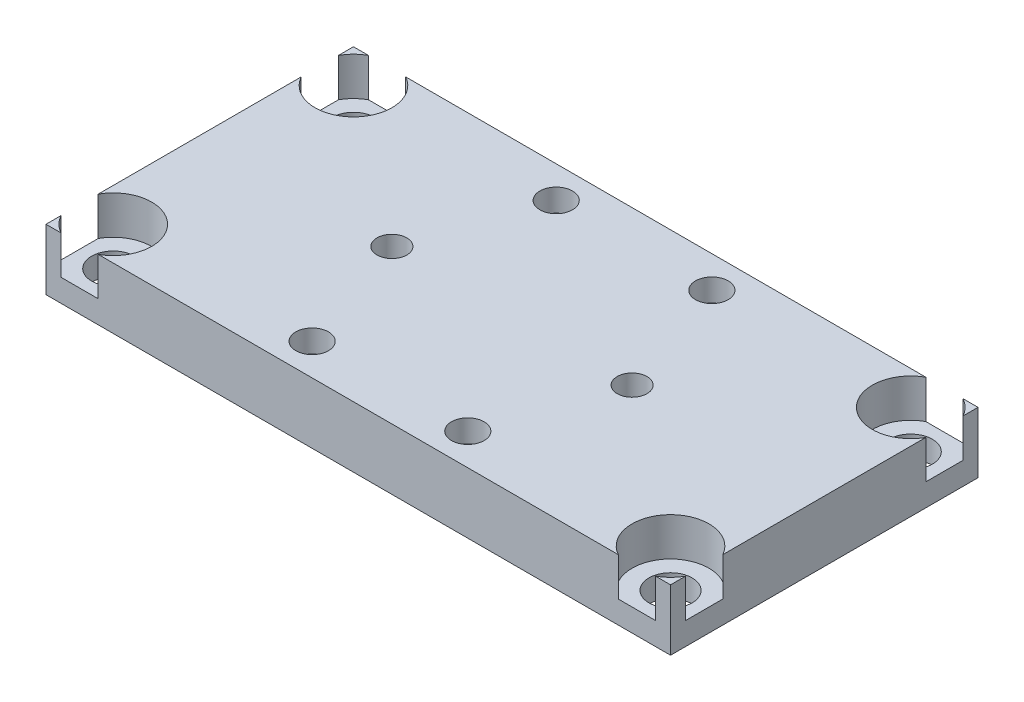
ISO-10303-21;
HEADER;
FILE_DESCRIPTION(('STEP AP214'),'2;1');
FILE_NAME('part.step','',(''),(''),'','','');
FILE_SCHEMA(('AUTOMOTIVE_DESIGN { 1 0 10303 214 1 1 1 1 }'));
ENDSEC;
DATA;
#1=APPLICATION_CONTEXT('core data for automotive mechanical design processes');
#2=APPLICATION_PROTOCOL_DEFINITION('international standard','automotive_design',2000,#1);
#3=PRODUCT_CONTEXT('',#1,'mechanical');
#4=PRODUCT('Part','Part','',(#3));
#5=PRODUCT_RELATED_PRODUCT_CATEGORY('part','',(#4));
#6=PRODUCT_DEFINITION_FORMATION('','',#4);
#7=PRODUCT_DEFINITION_CONTEXT('part definition',#1,'design');
#8=PRODUCT_DEFINITION('design','',#6,#7);
#9=PRODUCT_DEFINITION_SHAPE('','',#8);
#10=(LENGTH_UNIT() NAMED_UNIT(*) SI_UNIT(.MILLI.,.METRE.));
#11=(NAMED_UNIT(*) PLANE_ANGLE_UNIT() SI_UNIT($,.RADIAN.));
#12=(NAMED_UNIT(*) SI_UNIT($,.STERADIAN.) SOLID_ANGLE_UNIT());
#13=UNCERTAINTY_MEASURE_WITH_UNIT(LENGTH_MEASURE(1.E-05),#10,'distance_accuracy_value','');
#14=(GEOMETRIC_REPRESENTATION_CONTEXT(3) GLOBAL_UNCERTAINTY_ASSIGNED_CONTEXT((#13)) GLOBAL_UNIT_ASSIGNED_CONTEXT((#10,
#11,#12)) REPRESENTATION_CONTEXT('',''));
#15=CARTESIAN_POINT('',(0.,0.,0.));
#16=DIRECTION('',(0.,0.,1.));
#17=DIRECTION('',(1.,0.,0.));
#18=AXIS2_PLACEMENT_3D('',#15,#16,#17);
#19=CARTESIAN_POINT('',(32.5,6.35,-16.));
#20=DIRECTION('',(0.,-1.,0.));
#21=DIRECTION('',(0.,0.,-1.));
#22=AXIS2_PLACEMENT_3D('',#19,#20,#21);
#23=PLANE('',#22);
#24=DIRECTION('',(0.,0.,-1.));
#25=VECTOR('',#24,1.);
#26=CARTESIAN_POINT('',(32.5,6.35,16.));
#27=LINE('',#26,#25);
#28=CARTESIAN_POINT('',(32.5,6.35,16.));
#29=VERTEX_POINT('',#28);
#30=CARTESIAN_POINT('',(32.5,6.35,14.4364916731037));
#31=VERTEX_POINT('',#30);
#32=EDGE_CURVE('E330',#29,#31,#27,.T.);
#33=ORIENTED_EDGE('',*,*,#32,.T.);
#34=CARTESIAN_POINT('',(29.,6.35,12.5));
#35=DIRECTION('',(0.,1.,0.));
#36=DIRECTION('',(0.,0.,1.));
#37=AXIS2_PLACEMENT_3D('',#34,#35,#36);
#38=CIRCLE('',#37,4.);
#39=CARTESIAN_POINT('',(30.9364916731037,6.35,16.));
#40=VERTEX_POINT('',#39);
#41=EDGE_CURVE('E242',#40,#31,#38,.T.);
#42=ORIENTED_EDGE('',*,*,#41,.F.);
#43=DIRECTION('',(1.,0.,0.));
#44=VECTOR('',#43,1.);
#45=CARTESIAN_POINT('',(-32.5,6.35,16.));
#46=LINE('',#45,#44);
#47=EDGE_CURVE('E344',#40,#29,#46,.T.);
#48=ORIENTED_EDGE('',*,*,#47,.T.);
#49=EDGE_LOOP('',(#33,#42,#48));
#50=FACE_BOUND('',#49,.T.);
#51=ADVANCED_FACE('F31',(#50),#23,.F.);
#52=DIRECTION('',(-1.,0.,0.));
#53=VECTOR('',#52,1.);
#54=CARTESIAN_POINT('',(-32.5,6.35,-16.));
#55=LINE('',#54,#53);
#56=CARTESIAN_POINT('',(32.5,6.35,-16.));
#57=VERTEX_POINT('',#56);
#58=CARTESIAN_POINT('',(30.9364916731037,6.35,-16.));
#59=VERTEX_POINT('',#58);
#60=EDGE_CURVE('E336',#57,#59,#55,.T.);
#61=ORIENTED_EDGE('',*,*,#60,.T.);
#62=CARTESIAN_POINT('',(29.,6.35,-12.5));
#63=DIRECTION('',(0.,1.,0.));
#64=DIRECTION('',(0.,0.,1.));
#65=AXIS2_PLACEMENT_3D('',#62,#63,#64);
#66=CIRCLE('',#65,4.);
#67=CARTESIAN_POINT('',(32.5,6.35,-14.4364916731037));
#68=VERTEX_POINT('',#67);
#69=EDGE_CURVE('E264',#68,#59,#66,.T.);
#70=ORIENTED_EDGE('',*,*,#69,.F.);
#71=EDGE_CURVE('E335',#68,#57,#27,.T.);
#72=ORIENTED_EDGE('',*,*,#71,.T.);
#73=EDGE_LOOP('',(#61,#70,#72));
#74=FACE_BOUND('',#73,.T.);
#75=ADVANCED_FACE('F418',(#74),#23,.F.);
#76=CARTESIAN_POINT('',(-32.5,6.35,16.));
#77=VERTEX_POINT('',#76);
#78=CARTESIAN_POINT('',(-30.9364916731037,6.35,16.));
#79=VERTEX_POINT('',#78);
#80=EDGE_CURVE('E346',#77,#79,#46,.T.);
#81=ORIENTED_EDGE('',*,*,#80,.T.);
#82=CARTESIAN_POINT('',(-29.,6.35,12.5));
#83=DIRECTION('',(0.,1.,0.));
#84=DIRECTION('',(0.,0.,1.));
#85=AXIS2_PLACEMENT_3D('',#82,#83,#84);
#86=CIRCLE('',#85,4.);
#87=CARTESIAN_POINT('',(-32.5,6.35,14.4364916731037));
#88=VERTEX_POINT('',#87);
#89=EDGE_CURVE('E282',#88,#79,#86,.T.);
#90=ORIENTED_EDGE('',*,*,#89,.F.);
#91=DIRECTION('',(0.,0.,1.));
#92=VECTOR('',#91,1.);
#93=CARTESIAN_POINT('',(-32.5,6.35,16.));
#94=LINE('',#93,#92);
#95=EDGE_CURVE('E339',#88,#77,#94,.T.);
#96=ORIENTED_EDGE('',*,*,#95,.T.);
#97=EDGE_LOOP('',(#81,#90,#96));
#98=FACE_BOUND('',#97,.T.);
#99=ADVANCED_FACE('F470',(#98),#23,.F.);
#100=CARTESIAN_POINT('',(12.5,6.35,0.));
#101=DIRECTION('',(0.,1.,0.));
#102=DIRECTION('',(0.,0.,1.));
#103=AXIS2_PLACEMENT_3D('',#100,#101,#102);
#104=CIRCLE('',#103,1.55);
#105=CARTESIAN_POINT('',(12.5,6.35,1.55));
#106=VERTEX_POINT('',#105);
#107=EDGE_CURVE('E183',#106,#106,#104,.T.);
#108=ORIENTED_EDGE('',*,*,#107,.F.);
#109=EDGE_LOOP('',(#108));
#110=FACE_BOUND('',#109,.T.);
#111=CARTESIAN_POINT('',(-12.5,6.35,0.));
#112=DIRECTION('',(0.,1.,0.));
#113=DIRECTION('',(0.,0.,1.));
#114=AXIS2_PLACEMENT_3D('',#111,#112,#113);
#115=CIRCLE('',#114,1.55);
#116=CARTESIAN_POINT('',(-12.5,6.35,1.55));
#117=VERTEX_POINT('',#116);
#118=EDGE_CURVE('E182',#117,#117,#115,.T.);
#119=ORIENTED_EDGE('',*,*,#118,.F.);
#120=EDGE_LOOP('',(#119));
#121=FACE_BOUND('',#120,.T.);
#122=CARTESIAN_POINT('',(8.1,6.35,-12.7));
#123=DIRECTION('',(0.,-1.,0.));
#124=DIRECTION('',(0.,0.,-1.));
#125=AXIS2_PLACEMENT_3D('',#122,#123,#124);
#126=CIRCLE('',#125,1.7);
#127=CARTESIAN_POINT('',(8.1,6.35,-14.4));
#128=VERTEX_POINT('',#127);
#129=EDGE_CURVE('E202',#128,#128,#126,.T.);
#130=ORIENTED_EDGE('',*,*,#129,.T.);
#131=EDGE_LOOP('',(#130));
#132=FACE_BOUND('',#131,.T.);
#133=CARTESIAN_POINT('',(8.1,6.35,12.7));
#134=DIRECTION('',(0.,-1.,0.));
#135=DIRECTION('',(0.,0.,-1.));
#136=AXIS2_PLACEMENT_3D('',#133,#134,#135);
#137=CIRCLE('',#136,1.7);
#138=CARTESIAN_POINT('',(8.1,6.35,11.));
#139=VERTEX_POINT('',#138);
#140=EDGE_CURVE('E214',#139,#139,#137,.T.);
#141=ORIENTED_EDGE('',*,*,#140,.T.);
#142=EDGE_LOOP('',(#141));
#143=FACE_BOUND('',#142,.T.);
#144=CARTESIAN_POINT('',(-8.1,6.35,-12.7));
#145=DIRECTION('',(0.,-1.,0.));
#146=DIRECTION('',(0.,0.,-1.));
#147=AXIS2_PLACEMENT_3D('',#144,#145,#146);
#148=CIRCLE('',#147,1.7);
#149=CARTESIAN_POINT('',(-8.1,6.35,-14.4));
#150=VERTEX_POINT('',#149);
#151=EDGE_CURVE('E226',#150,#150,#148,.T.);
#152=ORIENTED_EDGE('',*,*,#151,.T.);
#153=EDGE_LOOP('',(#152));
#154=FACE_BOUND('',#153,.T.);
#155=CARTESIAN_POINT('',(-8.1,6.35,12.7));
#156=DIRECTION('',(0.,-1.,0.));
#157=DIRECTION('',(0.,0.,-1.));
#158=AXIS2_PLACEMENT_3D('',#155,#156,#157);
#159=CIRCLE('',#158,1.7);
#160=CARTESIAN_POINT('',(-8.1,6.35,11.));
#161=VERTEX_POINT('',#160);
#162=EDGE_CURVE('E238',#161,#161,#159,.T.);
#163=ORIENTED_EDGE('',*,*,#162,.T.);
#164=EDGE_LOOP('',(#163));
#165=FACE_BOUND('',#164,.T.);
#166=CARTESIAN_POINT('',(-27.0635083268963,6.35,16.));
#167=VERTEX_POINT('',#166);
#168=CARTESIAN_POINT('',(27.0635083268963,6.35,16.));
#169=VERTEX_POINT('',#168);
#170=EDGE_CURVE('E350',#167,#169,#46,.T.);
#171=ORIENTED_EDGE('',*,*,#170,.T.);
#172=CARTESIAN_POINT('',(32.5,6.35,10.5635083268963));
#173=VERTEX_POINT('',#172);
#174=EDGE_CURVE('E241',#173,#169,#38,.T.);
#175=ORIENTED_EDGE('',*,*,#174,.F.);
#176=CARTESIAN_POINT('',(32.5,6.35,-10.5635083268963));
#177=VERTEX_POINT('',#176);
#178=EDGE_CURVE('E334',#173,#177,#27,.T.);
#179=ORIENTED_EDGE('',*,*,#178,.T.);
#180=CARTESIAN_POINT('',(27.0635083268963,6.35,-16.));
#181=VERTEX_POINT('',#180);
#182=EDGE_CURVE('E261',#181,#177,#66,.T.);
#183=ORIENTED_EDGE('',*,*,#182,.F.);
#184=CARTESIAN_POINT('',(-27.0635083268963,6.35,-16.));
#185=VERTEX_POINT('',#184);
#186=EDGE_CURVE('E340',#181,#185,#55,.T.);
#187=ORIENTED_EDGE('',*,*,#186,.T.);
#188=CARTESIAN_POINT('',(-29.,6.35,-12.5));
#189=DIRECTION('',(0.,-1.,0.));
#190=DIRECTION('',(0.,0.,-1.));
#191=AXIS2_PLACEMENT_3D('',#188,#189,#190);
#192=CIRCLE('',#191,4.);
#193=CARTESIAN_POINT('',(-32.5,6.35,-10.5635083268963));
#194=VERTEX_POINT('',#193);
#195=EDGE_CURVE('E373',#185,#194,#192,.T.);
#196=ORIENTED_EDGE('',*,*,#195,.T.);
#197=CARTESIAN_POINT('',(-32.5,6.35,10.5635083268963));
#198=VERTEX_POINT('',#197);
#199=EDGE_CURVE('E345',#194,#198,#94,.T.);
#200=ORIENTED_EDGE('',*,*,#199,.T.);
#201=EDGE_CURVE('E283',#167,#198,#86,.T.);
#202=ORIENTED_EDGE('',*,*,#201,.F.);
#203=EDGE_LOOP('',(#171,#175,#179,#183,#187,#196,#200,#202));
#204=FACE_BOUND('',#203,.T.);
#205=ADVANCED_FACE('F440',(#110,#121,#132,#143,#154,#165,#204),#23,.F.);
#206=CARTESIAN_POINT('',(32.5,6.35,16.));
#207=DIRECTION('',(-1.,0.,0.));
#208=DIRECTION('',(0.,0.,1.));
#209=AXIS2_PLACEMENT_3D('',#206,#207,#208);
#210=PLANE('',#209);
#211=DIRECTION('',(0.,0.,1.));
#212=VECTOR('',#211,1.);
#213=CARTESIAN_POINT('',(32.5,2.35,16.));
#214=LINE('',#213,#212);
#215=CARTESIAN_POINT('',(32.5,2.35,10.5635083268963));
#216=VERTEX_POINT('',#215);
#217=CARTESIAN_POINT('',(32.5,2.35,14.4364916731037));
#218=VERTEX_POINT('',#217);
#219=EDGE_CURVE('E258',#216,#218,#214,.T.);
#220=ORIENTED_EDGE('',*,*,#219,.T.);
#221=DIRECTION('',(0.,1.,0.));
#222=VECTOR('',#221,1.);
#223=CARTESIAN_POINT('',(32.5,6.35,14.4364916731037));
#224=LINE('',#223,#222);
#225=EDGE_CURVE('E255',#218,#31,#224,.T.);
#226=ORIENTED_EDGE('',*,*,#225,.T.);
#227=ORIENTED_EDGE('',*,*,#32,.F.);
#228=DIRECTION('',(0.,-1.,0.));
#229=VECTOR('',#228,1.);
#230=CARTESIAN_POINT('',(32.5,6.35,16.));
#231=LINE('',#230,#229);
#232=CARTESIAN_POINT('',(32.5,0.,16.));
#233=VERTEX_POINT('',#232);
#234=EDGE_CURVE('E349',#29,#233,#231,.T.);
#235=ORIENTED_EDGE('',*,*,#234,.T.);
#236=DIRECTION('',(0.,0.,-1.));
#237=VECTOR('',#236,1.);
#238=CARTESIAN_POINT('',(32.5,0.,16.));
#239=LINE('',#238,#237);
#240=CARTESIAN_POINT('',(32.5,0.,-16.));
#241=VERTEX_POINT('',#240);
#242=EDGE_CURVE('E329',#233,#241,#239,.T.);
#243=ORIENTED_EDGE('',*,*,#242,.T.);
#244=DIRECTION('',(0.,-1.,0.));
#245=VECTOR('',#244,1.);
#246=CARTESIAN_POINT('',(32.5,6.35,-16.));
#247=LINE('',#246,#245);
#248=EDGE_CURVE('E367',#57,#241,#247,.T.);
#249=ORIENTED_EDGE('',*,*,#248,.F.);
#250=ORIENTED_EDGE('',*,*,#71,.F.);
#251=DIRECTION('',(0.,1.,0.));
#252=VECTOR('',#251,1.);
#253=CARTESIAN_POINT('',(32.5,6.35,-14.4364916731037));
#254=LINE('',#253,#252);
#255=CARTESIAN_POINT('',(32.5,2.35,-14.4364916731037));
#256=VERTEX_POINT('',#255);
#257=EDGE_CURVE('E273',#68,#256,#254,.F.);
#258=ORIENTED_EDGE('',*,*,#257,.T.);
#259=DIRECTION('',(0.,0.,1.));
#260=VECTOR('',#259,1.);
#261=CARTESIAN_POINT('',(32.5,2.35,16.));
#262=LINE('',#261,#260);
#263=CARTESIAN_POINT('',(32.5,2.35,-10.5635083268963));
#264=VERTEX_POINT('',#263);
#265=EDGE_CURVE('E279',#256,#264,#262,.T.);
#266=ORIENTED_EDGE('',*,*,#265,.T.);
#267=DIRECTION('',(0.,1.,0.));
#268=VECTOR('',#267,1.);
#269=CARTESIAN_POINT('',(32.5,6.35,-10.5635083268963));
#270=LINE('',#269,#268);
#271=EDGE_CURVE('E276',#264,#177,#270,.T.);
#272=ORIENTED_EDGE('',*,*,#271,.T.);
#273=ORIENTED_EDGE('',*,*,#178,.F.);
#274=DIRECTION('',(0.,1.,0.));
#275=VECTOR('',#274,1.);
#276=CARTESIAN_POINT('',(32.5,6.35,10.5635083268963));
#277=LINE('',#276,#275);
#278=EDGE_CURVE('E252',#173,#216,#277,.F.);
#279=ORIENTED_EDGE('',*,*,#278,.T.);
#280=EDGE_LOOP('',(#220,#226,#227,#235,#243,#249,#250,#258,#266,#272,#273,#279));
#281=FACE_BOUND('',#280,.T.);
#282=ADVANCED_FACE('F33',(#281),#210,.F.);
#283=CARTESIAN_POINT('',(-32.5,6.35,-16.));
#284=DIRECTION('',(0.,0.,1.));
#285=DIRECTION('',(1.,0.,0.));
#286=AXIS2_PLACEMENT_3D('',#283,#284,#285);
#287=PLANE('',#286);
#288=DIRECTION('',(1.,0.,0.));
#289=VECTOR('',#288,1.);
#290=CARTESIAN_POINT('',(-32.5,2.35,-16.));
#291=LINE('',#290,#289);
#292=CARTESIAN_POINT('',(27.0635083268963,2.35,-16.));
#293=VERTEX_POINT('',#292);
#294=CARTESIAN_POINT('',(30.9364916731037,2.35,-16.));
#295=VERTEX_POINT('',#294);
#296=EDGE_CURVE('E389',#293,#295,#291,.T.);
#297=ORIENTED_EDGE('',*,*,#296,.T.);
#298=DIRECTION('',(0.,1.,0.));
#299=VECTOR('',#298,1.);
#300=CARTESIAN_POINT('',(30.9364916731037,6.35,-16.));
#301=LINE('',#300,#299);
#302=EDGE_CURVE('E392',#295,#59,#301,.T.);
#303=ORIENTED_EDGE('',*,*,#302,.T.);
#304=ORIENTED_EDGE('',*,*,#60,.F.);
#305=ORIENTED_EDGE('',*,*,#248,.T.);
#306=DIRECTION('',(-1.,0.,0.));
#307=VECTOR('',#306,1.);
#308=CARTESIAN_POINT('',(-32.5,0.,-16.));
#309=LINE('',#308,#307);
#310=CARTESIAN_POINT('',(-32.5,0.,-16.));
#311=VERTEX_POINT('',#310);
#312=EDGE_CURVE('E353',#241,#311,#309,.T.);
#313=ORIENTED_EDGE('',*,*,#312,.T.);
#314=DIRECTION('',(0.,-1.,0.));
#315=VECTOR('',#314,1.);
#316=CARTESIAN_POINT('',(-32.5,6.35,-16.));
#317=LINE('',#316,#315);
#318=CARTESIAN_POINT('',(-32.5,6.35,-16.));
#319=VERTEX_POINT('',#318);
#320=EDGE_CURVE('E364',#319,#311,#317,.T.);
#321=ORIENTED_EDGE('',*,*,#320,.F.);
#322=CARTESIAN_POINT('',(-30.9364916731037,6.35,-16.));
#323=VERTEX_POINT('',#322);
#324=EDGE_CURVE('E333',#323,#319,#55,.T.);
#325=ORIENTED_EDGE('',*,*,#324,.F.);
#326=DIRECTION('',(0.,1.,0.));
#327=VECTOR('',#326,1.);
#328=CARTESIAN_POINT('',(-30.9364916731037,6.35,-16.));
#329=LINE('',#328,#327);
#330=CARTESIAN_POINT('',(-30.9364916731037,2.35,-16.));
#331=VERTEX_POINT('',#330);
#332=EDGE_CURVE('E320',#323,#331,#329,.F.);
#333=ORIENTED_EDGE('',*,*,#332,.T.);
#334=DIRECTION('',(1.,0.,0.));
#335=VECTOR('',#334,1.);
#336=CARTESIAN_POINT('',(-32.5,2.35,-16.));
#337=LINE('',#336,#335);
#338=CARTESIAN_POINT('',(-27.0635083268963,2.35,-16.));
#339=VERTEX_POINT('',#338);
#340=EDGE_CURVE('E326',#331,#339,#337,.T.);
#341=ORIENTED_EDGE('',*,*,#340,.T.);
#342=DIRECTION('',(0.,1.,0.));
#343=VECTOR('',#342,1.);
#344=CARTESIAN_POINT('',(-27.0635083268963,6.35,-16.));
#345=LINE('',#344,#343);
#346=EDGE_CURVE('E323',#339,#185,#345,.T.);
#347=ORIENTED_EDGE('',*,*,#346,.T.);
#348=ORIENTED_EDGE('',*,*,#186,.F.);
#349=DIRECTION('',(0.,1.,0.));
#350=VECTOR('',#349,1.);
#351=CARTESIAN_POINT('',(27.0635083268963,6.35,-16.));
#352=LINE('',#351,#350);
#353=EDGE_CURVE('E386',#181,#293,#352,.F.);
#354=ORIENTED_EDGE('',*,*,#353,.T.);
#355=EDGE_LOOP('',(#297,#303,#304,#305,#313,#321,#325,#333,#341,#347,#348,#354));
#356=FACE_BOUND('',#355,.T.);
#357=ADVANCED_FACE('F421',(#356),#287,.F.);
#358=CARTESIAN_POINT('',(-32.5,6.35,16.));
#359=DIRECTION('',(1.,0.,0.));
#360=DIRECTION('',(0.,0.,-1.));
#361=AXIS2_PLACEMENT_3D('',#358,#359,#360);
#362=PLANE('',#361);
#363=DIRECTION('',(0.,0.,-1.));
#364=VECTOR('',#363,1.);
#365=CARTESIAN_POINT('',(-32.5,2.35,16.));
#366=LINE('',#365,#364);
#367=CARTESIAN_POINT('',(-32.5,2.35,14.4364916731037));
#368=VERTEX_POINT('',#367);
#369=CARTESIAN_POINT('',(-32.5,2.35,10.5635083268963));
#370=VERTEX_POINT('',#369);
#371=EDGE_CURVE('E301',#368,#370,#366,.T.);
#372=ORIENTED_EDGE('',*,*,#371,.T.);
#373=DIRECTION('',(0.,1.,0.));
#374=VECTOR('',#373,1.);
#375=CARTESIAN_POINT('',(-32.5,6.35,10.5635083268963));
#376=LINE('',#375,#374);
#377=EDGE_CURVE('E298',#370,#198,#376,.T.);
#378=ORIENTED_EDGE('',*,*,#377,.T.);
#379=ORIENTED_EDGE('',*,*,#199,.F.);
#380=DIRECTION('',(0.,1.,0.));
#381=VECTOR('',#380,1.);
#382=CARTESIAN_POINT('',(-32.5,6.35,-10.5635083268963));
#383=LINE('',#382,#381);
#384=CARTESIAN_POINT('',(-32.5,2.35,-10.5635083268963));
#385=VERTEX_POINT('',#384);
#386=EDGE_CURVE('E314',#194,#385,#383,.F.);
#387=ORIENTED_EDGE('',*,*,#386,.T.);
#388=DIRECTION('',(0.,0.,-1.));
#389=VECTOR('',#388,1.);
#390=CARTESIAN_POINT('',(-32.5,2.35,16.));
#391=LINE('',#390,#389);
#392=CARTESIAN_POINT('',(-32.5,2.35,-14.4364916731037));
#393=VERTEX_POINT('',#392);
#394=EDGE_CURVE('E374',#385,#393,#391,.T.);
#395=ORIENTED_EDGE('',*,*,#394,.T.);
#396=DIRECTION('',(0.,1.,0.));
#397=VECTOR('',#396,1.);
#398=CARTESIAN_POINT('',(-32.5,6.35,-14.4364916731037));
#399=LINE('',#398,#397);
#400=CARTESIAN_POINT('',(-32.5,6.35,-14.4364916731037));
#401=VERTEX_POINT('',#400);
#402=EDGE_CURVE('E317',#393,#401,#399,.T.);
#403=ORIENTED_EDGE('',*,*,#402,.T.);
#404=EDGE_CURVE('E341',#319,#401,#94,.T.);
#405=ORIENTED_EDGE('',*,*,#404,.F.);
#406=ORIENTED_EDGE('',*,*,#320,.T.);
#407=DIRECTION('',(0.,0.,1.));
#408=VECTOR('',#407,1.);
#409=CARTESIAN_POINT('',(-32.5,0.,16.));
#410=LINE('',#409,#408);
#411=CARTESIAN_POINT('',(-32.5,0.,16.));
#412=VERTEX_POINT('',#411);
#413=EDGE_CURVE('E355',#311,#412,#410,.T.);
#414=ORIENTED_EDGE('',*,*,#413,.T.);
#415=DIRECTION('',(0.,-1.,0.));
#416=VECTOR('',#415,1.);
#417=CARTESIAN_POINT('',(-32.5,6.35,16.));
#418=LINE('',#417,#416);
#419=EDGE_CURVE('E361',#77,#412,#418,.T.);
#420=ORIENTED_EDGE('',*,*,#419,.F.);
#421=ORIENTED_EDGE('',*,*,#95,.F.);
#422=DIRECTION('',(0.,1.,0.));
#423=VECTOR('',#422,1.);
#424=CARTESIAN_POINT('',(-32.5,6.35,14.4364916731037));
#425=LINE('',#424,#423);
#426=EDGE_CURVE('E295',#88,#368,#425,.F.);
#427=ORIENTED_EDGE('',*,*,#426,.T.);
#428=EDGE_LOOP('',(#372,#378,#379,#387,#395,#403,#405,#406,#414,#420,#421,#427));
#429=FACE_BOUND('',#428,.T.);
#430=ADVANCED_FACE('F433',(#429),#362,.F.);
#431=CARTESIAN_POINT('',(-32.5,6.35,16.));
#432=DIRECTION('',(0.,0.,-1.));
#433=DIRECTION('',(-1.,0.,0.));
#434=AXIS2_PLACEMENT_3D('',#431,#432,#433);
#435=PLANE('',#434);
#436=DIRECTION('',(-1.,0.,0.));
#437=VECTOR('',#436,1.);
#438=CARTESIAN_POINT('',(-32.5,2.35,16.));
#439=LINE('',#438,#437);
#440=CARTESIAN_POINT('',(30.9364916731037,2.35,16.));
#441=VERTEX_POINT('',#440);
#442=CARTESIAN_POINT('',(27.0635083268963,2.35,16.));
#443=VERTEX_POINT('',#442);
#444=EDGE_CURVE('E39',#441,#443,#439,.T.);
#445=ORIENTED_EDGE('',*,*,#444,.T.);
#446=DIRECTION('',(0.,1.,0.));
#447=VECTOR('',#446,1.);
#448=CARTESIAN_POINT('',(27.0635083268963,6.35,16.));
#449=LINE('',#448,#447);
#450=EDGE_CURVE('E11',#443,#169,#449,.T.);
#451=ORIENTED_EDGE('',*,*,#450,.T.);
#452=ORIENTED_EDGE('',*,*,#170,.F.);
#453=DIRECTION('',(0.,1.,0.));
#454=VECTOR('',#453,1.);
#455=CARTESIAN_POINT('',(-27.0635083268963,6.35,16.));
#456=LINE('',#455,#454);
#457=CARTESIAN_POINT('',(-27.0635083268963,2.35,16.));
#458=VERTEX_POINT('',#457);
#459=EDGE_CURVE('E377',#167,#458,#456,.F.);
#460=ORIENTED_EDGE('',*,*,#459,.T.);
#461=DIRECTION('',(-1.,0.,0.));
#462=VECTOR('',#461,1.);
#463=CARTESIAN_POINT('',(-32.5,2.35,16.));
#464=LINE('',#463,#462);
#465=CARTESIAN_POINT('',(-30.9364916731037,2.35,16.));
#466=VERTEX_POINT('',#465);
#467=EDGE_CURVE('E380',#458,#466,#464,.T.);
#468=ORIENTED_EDGE('',*,*,#467,.T.);
#469=DIRECTION('',(0.,1.,0.));
#470=VECTOR('',#469,1.);
#471=CARTESIAN_POINT('',(-30.9364916731037,6.35,16.));
#472=LINE('',#471,#470);
#473=EDGE_CURVE('E383',#466,#79,#472,.T.);
#474=ORIENTED_EDGE('',*,*,#473,.T.);
#475=ORIENTED_EDGE('',*,*,#80,.F.);
#476=ORIENTED_EDGE('',*,*,#419,.T.);
#477=DIRECTION('',(1.,0.,0.));
#478=VECTOR('',#477,1.);
#479=CARTESIAN_POINT('',(-32.5,0.,16.));
#480=LINE('',#479,#478);
#481=EDGE_CURVE('E357',#412,#233,#480,.T.);
#482=ORIENTED_EDGE('',*,*,#481,.T.);
#483=ORIENTED_EDGE('',*,*,#234,.F.);
#484=ORIENTED_EDGE('',*,*,#47,.F.);
#485=DIRECTION('',(0.,1.,0.));
#486=VECTOR('',#485,1.);
#487=CARTESIAN_POINT('',(30.9364916731037,6.35,16.));
#488=LINE('',#487,#486);
#489=EDGE_CURVE('E395',#40,#441,#488,.F.);
#490=ORIENTED_EDGE('',*,*,#489,.T.);
#491=EDGE_LOOP('',(#445,#451,#452,#460,#468,#474,#475,#476,#482,#483,#484,#490));
#492=FACE_BOUND('',#491,.T.);
#493=ADVANCED_FACE('F399',(#492),#435,.F.);
#494=ORIENTED_EDGE('',*,*,#404,.T.);
#495=EDGE_CURVE('E370',#401,#323,#192,.T.);
#496=ORIENTED_EDGE('',*,*,#495,.T.);
#497=ORIENTED_EDGE('',*,*,#324,.T.);
#498=EDGE_LOOP('',(#494,#496,#497));
#499=FACE_BOUND('',#498,.T.);
#500=ADVANCED_FACE('F436',(#499),#23,.F.);
#501=CARTESIAN_POINT('',(32.5,0.,-16.));
#502=DIRECTION('',(0.,-1.,0.));
#503=DIRECTION('',(0.,0.,-1.));
#504=AXIS2_PLACEMENT_3D('',#501,#502,#503);
#505=PLANE('',#504);
#506=CARTESIAN_POINT('',(8.1,0.,-12.7));
#507=DIRECTION('',(0.,-1.,0.));
#508=DIRECTION('',(0.,0.,-1.));
#509=AXIS2_PLACEMENT_3D('',#506,#507,#508);
#510=CIRCLE('',#509,3.25);
#511=CARTESIAN_POINT('',(8.1,0.,-15.95));
#512=VERTEX_POINT('',#511);
#513=EDGE_CURVE('E193',#512,#512,#510,.T.);
#514=ORIENTED_EDGE('',*,*,#513,.F.);
#515=EDGE_LOOP('',(#514));
#516=FACE_BOUND('',#515,.T.);
#517=CARTESIAN_POINT('',(8.1,0.,12.7));
#518=DIRECTION('',(0.,-1.,0.));
#519=DIRECTION('',(0.,0.,-1.));
#520=AXIS2_PLACEMENT_3D('',#517,#518,#519);
#521=CIRCLE('',#520,3.25);
#522=CARTESIAN_POINT('',(8.1,0.,9.45));
#523=VERTEX_POINT('',#522);
#524=EDGE_CURVE('E205',#523,#523,#521,.T.);
#525=ORIENTED_EDGE('',*,*,#524,.F.);
#526=EDGE_LOOP('',(#525));
#527=FACE_BOUND('',#526,.T.);
#528=CARTESIAN_POINT('',(-8.1,0.,-12.7));
#529=DIRECTION('',(0.,-1.,0.));
#530=DIRECTION('',(0.,0.,-1.));
#531=AXIS2_PLACEMENT_3D('',#528,#529,#530);
#532=CIRCLE('',#531,3.25);
#533=CARTESIAN_POINT('',(-8.1,0.,-15.95));
#534=VERTEX_POINT('',#533);
#535=EDGE_CURVE('E217',#534,#534,#532,.T.);
#536=ORIENTED_EDGE('',*,*,#535,.F.);
#537=EDGE_LOOP('',(#536));
#538=FACE_BOUND('',#537,.T.);
#539=CARTESIAN_POINT('',(-8.1,0.,12.7));
#540=DIRECTION('',(0.,-1.,0.));
#541=DIRECTION('',(0.,0.,-1.));
#542=AXIS2_PLACEMENT_3D('',#539,#540,#541);
#543=CIRCLE('',#542,3.25);
#544=CARTESIAN_POINT('',(-8.1,0.,9.45));
#545=VERTEX_POINT('',#544);
#546=EDGE_CURVE('E229',#545,#545,#543,.T.);
#547=ORIENTED_EDGE('',*,*,#546,.F.);
#548=EDGE_LOOP('',(#547));
#549=FACE_BOUND('',#548,.T.);
#550=CARTESIAN_POINT('',(29.,0.,12.5));
#551=DIRECTION('',(0.,1.,0.));
#552=DIRECTION('',(0.,0.,1.));
#553=AXIS2_PLACEMENT_3D('',#550,#551,#552);
#554=CIRCLE('',#553,2.25);
#555=CARTESIAN_POINT('',(29.,0.,14.75));
#556=VERTEX_POINT('',#555);
#557=EDGE_CURVE('E249',#556,#556,#554,.T.);
#558=ORIENTED_EDGE('',*,*,#557,.T.);
#559=EDGE_LOOP('',(#558));
#560=FACE_BOUND('',#559,.T.);
#561=CARTESIAN_POINT('',(29.,0.,-12.5));
#562=DIRECTION('',(0.,1.,0.));
#563=DIRECTION('',(0.,0.,1.));
#564=AXIS2_PLACEMENT_3D('',#561,#562,#563);
#565=CIRCLE('',#564,2.25);
#566=CARTESIAN_POINT('',(29.,0.,-10.25));
#567=VERTEX_POINT('',#566);
#568=EDGE_CURVE('E270',#567,#567,#565,.T.);
#569=ORIENTED_EDGE('',*,*,#568,.T.);
#570=EDGE_LOOP('',(#569));
#571=FACE_BOUND('',#570,.T.);
#572=CARTESIAN_POINT('',(-29.,0.,12.5));
#573=DIRECTION('',(0.,1.,0.));
#574=DIRECTION('',(0.,0.,1.));
#575=AXIS2_PLACEMENT_3D('',#572,#573,#574);
#576=CIRCLE('',#575,2.25);
#577=CARTESIAN_POINT('',(-29.,0.,14.75));
#578=VERTEX_POINT('',#577);
#579=EDGE_CURVE('E292',#578,#578,#576,.T.);
#580=ORIENTED_EDGE('',*,*,#579,.T.);
#581=EDGE_LOOP('',(#580));
#582=FACE_BOUND('',#581,.T.);
#583=CARTESIAN_POINT('',(-29.,0.,-12.5));
#584=DIRECTION('',(0.,1.,0.));
#585=DIRECTION('',(0.,0.,1.));
#586=AXIS2_PLACEMENT_3D('',#583,#584,#585);
#587=CIRCLE('',#586,2.25);
#588=CARTESIAN_POINT('',(-29.,0.,-10.25));
#589=VERTEX_POINT('',#588);
#590=EDGE_CURVE('E311',#589,#589,#587,.T.);
#591=ORIENTED_EDGE('',*,*,#590,.T.);
#592=EDGE_LOOP('',(#591));
#593=FACE_BOUND('',#592,.T.);
#594=ORIENTED_EDGE('',*,*,#242,.F.);
#595=ORIENTED_EDGE('',*,*,#481,.F.);
#596=ORIENTED_EDGE('',*,*,#413,.F.);
#597=ORIENTED_EDGE('',*,*,#312,.F.);
#598=EDGE_LOOP('',(#594,#595,#596,#597));
#599=FACE_BOUND('',#598,.T.);
#600=ADVANCED_FACE('F427',(#516,#527,#538,#549,#560,#571,#582,#593,#599),#505,.T.);
#601=CARTESIAN_POINT('',(-26.75,2.35,-12.5));
#602=DIRECTION('',(0.,-1.,0.));
#603=DIRECTION('',(0.,0.,-1.));
#604=AXIS2_PLACEMENT_3D('',#601,#602,#603);
#605=PLANE('',#604);
#606=CARTESIAN_POINT('',(-29.,2.35,-12.5));
#607=DIRECTION('',(0.,1.,0.));
#608=DIRECTION('',(0.,0.,1.));
#609=AXIS2_PLACEMENT_3D('',#606,#607,#608);
#610=CIRCLE('',#609,2.25);
#611=CARTESIAN_POINT('',(-29.,2.35,-10.25));
#612=VERTEX_POINT('',#611);
#613=EDGE_CURVE('E308',#612,#612,#610,.T.);
#614=ORIENTED_EDGE('',*,*,#613,.F.);
#615=EDGE_LOOP('',(#614));
#616=FACE_BOUND('',#615,.T.);
#617=CARTESIAN_POINT('',(-29.,2.35,-12.5));
#618=DIRECTION('',(0.,1.,0.));
#619=DIRECTION('',(0.,0.,1.));
#620=AXIS2_PLACEMENT_3D('',#617,#618,#619);
#621=CIRCLE('',#620,4.);
#622=EDGE_CURVE('E307',#331,#393,#621,.T.);
#623=ORIENTED_EDGE('',*,*,#622,.T.);
#624=ORIENTED_EDGE('',*,*,#394,.F.);
#625=EDGE_CURVE('E304',#385,#339,#621,.T.);
#626=ORIENTED_EDGE('',*,*,#625,.T.);
#627=ORIENTED_EDGE('',*,*,#340,.F.);
#628=EDGE_LOOP('',(#623,#624,#626,#627));
#629=FACE_BOUND('',#628,.T.);
#630=ADVANCED_FACE('F449',(#616,#629),#605,.F.);
#631=CARTESIAN_POINT('',(-29.,6.35,-12.5));
#632=DIRECTION('',(0.,1.,0.));
#633=DIRECTION('',(0.,0.,1.));
#634=AXIS2_PLACEMENT_3D('',#631,#632,#633);
#635=CYLINDRICAL_SURFACE('',#634,4.);
#636=ORIENTED_EDGE('',*,*,#625,.F.);
#637=ORIENTED_EDGE('',*,*,#386,.F.);
#638=ORIENTED_EDGE('',*,*,#195,.F.);
#639=ORIENTED_EDGE('',*,*,#346,.F.);
#640=EDGE_LOOP('',(#636,#637,#638,#639));
#641=FACE_BOUND('',#640,.T.);
#642=ADVANCED_FACE('F445',(#641),#635,.F.);
#643=ORIENTED_EDGE('',*,*,#495,.F.);
#644=ORIENTED_EDGE('',*,*,#402,.F.);
#645=ORIENTED_EDGE('',*,*,#622,.F.);
#646=ORIENTED_EDGE('',*,*,#332,.F.);
#647=EDGE_LOOP('',(#643,#644,#645,#646));
#648=FACE_BOUND('',#647,.T.);
#649=ADVANCED_FACE('F451',(#648),#635,.F.);
#650=CARTESIAN_POINT('',(-29.,6.35,-12.5));
#651=DIRECTION('',(0.,1.,0.));
#652=DIRECTION('',(0.,0.,1.));
#653=AXIS2_PLACEMENT_3D('',#650,#651,#652);
#654=CYLINDRICAL_SURFACE('',#653,2.25);
#655=ORIENTED_EDGE('',*,*,#590,.F.);
#656=EDGE_LOOP('',(#655));
#657=FACE_BOUND('',#656,.T.);
#658=ORIENTED_EDGE('',*,*,#613,.T.);
#659=EDGE_LOOP('',(#658));
#660=FACE_BOUND('',#659,.T.);
#661=ADVANCED_FACE('F453',(#657,#660),#654,.F.);
#662=CARTESIAN_POINT('',(-26.75,2.35,12.5));
#663=DIRECTION('',(0.,-1.,0.));
#664=DIRECTION('',(0.,0.,-1.));
#665=AXIS2_PLACEMENT_3D('',#662,#663,#664);
#666=PLANE('',#665);
#667=CARTESIAN_POINT('',(-29.,2.35,12.5));
#668=DIRECTION('',(0.,1.,0.));
#669=DIRECTION('',(0.,0.,1.));
#670=AXIS2_PLACEMENT_3D('',#667,#668,#669);
#671=CIRCLE('',#670,2.25);
#672=CARTESIAN_POINT('',(-29.,2.35,14.75));
#673=VERTEX_POINT('',#672);
#674=EDGE_CURVE('E289',#673,#673,#671,.T.);
#675=ORIENTED_EDGE('',*,*,#674,.F.);
#676=EDGE_LOOP('',(#675));
#677=FACE_BOUND('',#676,.T.);
#678=CARTESIAN_POINT('',(-29.,2.35,12.5));
#679=DIRECTION('',(0.,1.,0.));
#680=DIRECTION('',(0.,0.,1.));
#681=AXIS2_PLACEMENT_3D('',#678,#679,#680);
#682=CIRCLE('',#681,4.);
#683=EDGE_CURVE('E285',#368,#466,#682,.T.);
#684=ORIENTED_EDGE('',*,*,#683,.T.);
#685=ORIENTED_EDGE('',*,*,#467,.F.);
#686=EDGE_CURVE('E286',#458,#370,#682,.T.);
#687=ORIENTED_EDGE('',*,*,#686,.T.);
#688=ORIENTED_EDGE('',*,*,#371,.F.);
#689=EDGE_LOOP('',(#684,#685,#687,#688));
#690=FACE_BOUND('',#689,.T.);
#691=ADVANCED_FACE('F459',(#677,#690),#666,.F.);
#692=CARTESIAN_POINT('',(-29.,6.35,12.5));
#693=DIRECTION('',(0.,1.,0.));
#694=DIRECTION('',(0.,0.,1.));
#695=AXIS2_PLACEMENT_3D('',#692,#693,#694);
#696=CYLINDRICAL_SURFACE('',#695,4.);
#697=ORIENTED_EDGE('',*,*,#686,.F.);
#698=ORIENTED_EDGE('',*,*,#459,.F.);
#699=ORIENTED_EDGE('',*,*,#201,.T.);
#700=ORIENTED_EDGE('',*,*,#377,.F.);
#701=EDGE_LOOP('',(#697,#698,#699,#700));
#702=FACE_BOUND('',#701,.T.);
#703=ADVANCED_FACE('F601',(#702),#696,.F.);
#704=ORIENTED_EDGE('',*,*,#89,.T.);
#705=ORIENTED_EDGE('',*,*,#473,.F.);
#706=ORIENTED_EDGE('',*,*,#683,.F.);
#707=ORIENTED_EDGE('',*,*,#426,.F.);
#708=EDGE_LOOP('',(#704,#705,#706,#707));
#709=FACE_BOUND('',#708,.T.);
#710=ADVANCED_FACE('F611',(#709),#696,.F.);
#711=CARTESIAN_POINT('',(-29.,6.35,12.5));
#712=DIRECTION('',(0.,1.,0.));
#713=DIRECTION('',(0.,0.,1.));
#714=AXIS2_PLACEMENT_3D('',#711,#712,#713);
#715=CYLINDRICAL_SURFACE('',#714,2.25);
#716=ORIENTED_EDGE('',*,*,#579,.F.);
#717=EDGE_LOOP('',(#716));
#718=FACE_BOUND('',#717,.T.);
#719=ORIENTED_EDGE('',*,*,#674,.T.);
#720=EDGE_LOOP('',(#719));
#721=FACE_BOUND('',#720,.T.);
#722=ADVANCED_FACE('F621',(#718,#721),#715,.F.);
#723=CARTESIAN_POINT('',(31.25,2.35,-12.5));
#724=DIRECTION('',(0.,-1.,0.));
#725=DIRECTION('',(0.,0.,-1.));
#726=AXIS2_PLACEMENT_3D('',#723,#724,#725);
#727=PLANE('',#726);
#728=CARTESIAN_POINT('',(29.,2.35,-12.5));
#729=DIRECTION('',(0.,1.,0.));
#730=DIRECTION('',(0.,0.,1.));
#731=AXIS2_PLACEMENT_3D('',#728,#729,#730);
#732=CIRCLE('',#731,2.25);
#733=CARTESIAN_POINT('',(29.,2.35,-10.25));
#734=VERTEX_POINT('',#733);
#735=EDGE_CURVE('E267',#734,#734,#732,.T.);
#736=ORIENTED_EDGE('',*,*,#735,.F.);
#737=EDGE_LOOP('',(#736));
#738=FACE_BOUND('',#737,.T.);
#739=CARTESIAN_POINT('',(29.,2.35,-12.5));
#740=DIRECTION('',(0.,1.,0.));
#741=DIRECTION('',(0.,0.,1.));
#742=AXIS2_PLACEMENT_3D('',#739,#740,#741);
#743=CIRCLE('',#742,4.);
#744=EDGE_CURVE('E266',#256,#295,#743,.T.);
#745=ORIENTED_EDGE('',*,*,#744,.T.);
#746=ORIENTED_EDGE('',*,*,#296,.F.);
#747=EDGE_CURVE('E54',#293,#264,#743,.T.);
#748=ORIENTED_EDGE('',*,*,#747,.T.);
#749=ORIENTED_EDGE('',*,*,#265,.F.);
#750=EDGE_LOOP('',(#745,#746,#748,#749));
#751=FACE_BOUND('',#750,.T.);
#752=ADVANCED_FACE('F630',(#738,#751),#727,.F.);
#753=CARTESIAN_POINT('',(29.,6.35,-12.5));
#754=DIRECTION('',(0.,1.,0.));
#755=DIRECTION('',(0.,0.,1.));
#756=AXIS2_PLACEMENT_3D('',#753,#754,#755);
#757=CYLINDRICAL_SURFACE('',#756,4.);
#758=ORIENTED_EDGE('',*,*,#747,.F.);
#759=ORIENTED_EDGE('',*,*,#353,.F.);
#760=ORIENTED_EDGE('',*,*,#182,.T.);
#761=ORIENTED_EDGE('',*,*,#271,.F.);
#762=EDGE_LOOP('',(#758,#759,#760,#761));
#763=FACE_BOUND('',#762,.T.);
#764=ADVANCED_FACE('F639',(#763),#757,.F.);
#765=ORIENTED_EDGE('',*,*,#69,.T.);
#766=ORIENTED_EDGE('',*,*,#302,.F.);
#767=ORIENTED_EDGE('',*,*,#744,.F.);
#768=ORIENTED_EDGE('',*,*,#257,.F.);
#769=EDGE_LOOP('',(#765,#766,#767,#768));
#770=FACE_BOUND('',#769,.T.);
#771=ADVANCED_FACE('F649',(#770),#757,.F.);
#772=CARTESIAN_POINT('',(29.,6.35,-12.5));
#773=DIRECTION('',(0.,1.,0.));
#774=DIRECTION('',(0.,0.,1.));
#775=AXIS2_PLACEMENT_3D('',#772,#773,#774);
#776=CYLINDRICAL_SURFACE('',#775,2.25);
#777=ORIENTED_EDGE('',*,*,#568,.F.);
#778=EDGE_LOOP('',(#777));
#779=FACE_BOUND('',#778,.T.);
#780=ORIENTED_EDGE('',*,*,#735,.T.);
#781=EDGE_LOOP('',(#780));
#782=FACE_BOUND('',#781,.T.);
#783=ADVANCED_FACE('F658',(#779,#782),#776,.F.);
#784=CARTESIAN_POINT('',(31.25,2.35,12.5));
#785=DIRECTION('',(0.,-1.,0.));
#786=DIRECTION('',(0.,0.,-1.));
#787=AXIS2_PLACEMENT_3D('',#784,#785,#786);
#788=PLANE('',#787);
#789=CARTESIAN_POINT('',(29.,2.35,12.5));
#790=DIRECTION('',(0.,1.,0.));
#791=DIRECTION('',(0.,0.,1.));
#792=AXIS2_PLACEMENT_3D('',#789,#790,#791);
#793=CIRCLE('',#792,2.25);
#794=CARTESIAN_POINT('',(29.,2.35,14.75));
#795=VERTEX_POINT('',#794);
#796=EDGE_CURVE('E246',#795,#795,#793,.T.);
#797=ORIENTED_EDGE('',*,*,#796,.F.);
#798=EDGE_LOOP('',(#797));
#799=FACE_BOUND('',#798,.T.);
#800=CARTESIAN_POINT('',(29.,2.35,12.5));
#801=DIRECTION('',(0.,1.,0.));
#802=DIRECTION('',(0.,0.,1.));
#803=AXIS2_PLACEMENT_3D('',#800,#801,#802);
#804=CIRCLE('',#803,4.);
#805=EDGE_CURVE('E244',#216,#443,#804,.T.);
#806=ORIENTED_EDGE('',*,*,#805,.T.);
#807=ORIENTED_EDGE('',*,*,#444,.F.);
#808=EDGE_CURVE('E46',#441,#218,#804,.T.);
#809=ORIENTED_EDGE('',*,*,#808,.T.);
#810=ORIENTED_EDGE('',*,*,#219,.F.);
#811=EDGE_LOOP('',(#806,#807,#809,#810));
#812=FACE_BOUND('',#811,.T.);
#813=ADVANCED_FACE('F405',(#799,#812),#788,.F.);
#814=CARTESIAN_POINT('',(29.,6.35,12.5));
#815=DIRECTION('',(0.,1.,0.));
#816=DIRECTION('',(0.,0.,1.));
#817=AXIS2_PLACEMENT_3D('',#814,#815,#816);
#818=CYLINDRICAL_SURFACE('',#817,4.);
#819=ORIENTED_EDGE('',*,*,#808,.F.);
#820=ORIENTED_EDGE('',*,*,#489,.F.);
#821=ORIENTED_EDGE('',*,*,#41,.T.);
#822=ORIENTED_EDGE('',*,*,#225,.F.);
#823=EDGE_LOOP('',(#819,#820,#821,#822));
#824=FACE_BOUND('',#823,.T.);
#825=ADVANCED_FACE('F676',(#824),#818,.F.);
#826=ORIENTED_EDGE('',*,*,#174,.T.);
#827=ORIENTED_EDGE('',*,*,#450,.F.);
#828=ORIENTED_EDGE('',*,*,#805,.F.);
#829=ORIENTED_EDGE('',*,*,#278,.F.);
#830=EDGE_LOOP('',(#826,#827,#828,#829));
#831=FACE_BOUND('',#830,.T.);
#832=ADVANCED_FACE('F408',(#831),#818,.F.);
#833=CARTESIAN_POINT('',(29.,6.35,12.5));
#834=DIRECTION('',(0.,1.,0.));
#835=DIRECTION('',(0.,0.,1.));
#836=AXIS2_PLACEMENT_3D('',#833,#834,#835);
#837=CYLINDRICAL_SURFACE('',#836,2.25);
#838=ORIENTED_EDGE('',*,*,#557,.F.);
#839=EDGE_LOOP('',(#838));
#840=FACE_BOUND('',#839,.T.);
#841=ORIENTED_EDGE('',*,*,#796,.T.);
#842=EDGE_LOOP('',(#841));
#843=FACE_BOUND('',#842,.T.);
#844=ADVANCED_FACE('F502',(#840,#843),#837,.F.);
#845=CARTESIAN_POINT('',(-8.1,0.,12.7));
#846=DIRECTION('',(0.,-1.,0.));
#847=DIRECTION('',(0.,0.,-1.));
#848=AXIS2_PLACEMENT_3D('',#845,#846,#847);
#849=CYLINDRICAL_SURFACE('',#848,1.7);
#850=ORIENTED_EDGE('',*,*,#162,.F.);
#851=EDGE_LOOP('',(#850));
#852=FACE_BOUND('',#851,.T.);
#853=CARTESIAN_POINT('',(-8.1,4.,12.7));
#854=DIRECTION('',(0.,-1.,0.));
#855=DIRECTION('',(0.,0.,-1.));
#856=AXIS2_PLACEMENT_3D('',#853,#854,#855);
#857=CIRCLE('',#856,1.7);
#858=CARTESIAN_POINT('',(-8.1,4.,11.));
#859=VERTEX_POINT('',#858);
#860=EDGE_CURVE('E235',#859,#859,#857,.T.);
#861=ORIENTED_EDGE('',*,*,#860,.T.);
#862=EDGE_LOOP('',(#861));
#863=FACE_BOUND('',#862,.T.);
#864=ADVANCED_FACE('F498',(#852,#863),#849,.F.);
#865=CARTESIAN_POINT('',(-6.4,4.,12.7));
#866=DIRECTION('',(0.,1.,0.));
#867=DIRECTION('',(0.,0.,1.));
#868=AXIS2_PLACEMENT_3D('',#865,#866,#867);
#869=PLANE('',#868);
#870=ORIENTED_EDGE('',*,*,#860,.F.);
#871=EDGE_LOOP('',(#870));
#872=FACE_BOUND('',#871,.T.);
#873=CARTESIAN_POINT('',(-8.1,4.,12.7));
#874=DIRECTION('',(0.,-1.,0.));
#875=DIRECTION('',(0.,0.,-1.));
#876=AXIS2_PLACEMENT_3D('',#873,#874,#875);
#877=CIRCLE('',#876,3.25);
#878=CARTESIAN_POINT('',(-8.1,4.,9.45));
#879=VERTEX_POINT('',#878);
#880=EDGE_CURVE('E232',#879,#879,#877,.T.);
#881=ORIENTED_EDGE('',*,*,#880,.T.);
#882=EDGE_LOOP('',(#881));
#883=FACE_BOUND('',#882,.T.);
#884=ADVANCED_FACE('F501',(#872,#883),#869,.F.);
#885=CARTESIAN_POINT('',(-8.1,0.,12.7));
#886=DIRECTION('',(0.,-1.,0.));
#887=DIRECTION('',(0.,0.,-1.));
#888=AXIS2_PLACEMENT_3D('',#885,#886,#887);
#889=CYLINDRICAL_SURFACE('',#888,3.25);
#890=ORIENTED_EDGE('',*,*,#880,.F.);
#891=EDGE_LOOP('',(#890));
#892=FACE_BOUND('',#891,.T.);
#893=ORIENTED_EDGE('',*,*,#546,.T.);
#894=EDGE_LOOP('',(#893));
#895=FACE_BOUND('',#894,.T.);
#896=ADVANCED_FACE('F508',(#892,#895),#889,.F.);
#897=CARTESIAN_POINT('',(-8.1,0.,-12.7));
#898=DIRECTION('',(0.,-1.,0.));
#899=DIRECTION('',(0.,0.,-1.));
#900=AXIS2_PLACEMENT_3D('',#897,#898,#899);
#901=CYLINDRICAL_SURFACE('',#900,1.7);
#902=ORIENTED_EDGE('',*,*,#151,.F.);
#903=EDGE_LOOP('',(#902));
#904=FACE_BOUND('',#903,.T.);
#905=CARTESIAN_POINT('',(-8.1,4.,-12.7));
#906=DIRECTION('',(0.,-1.,0.));
#907=DIRECTION('',(0.,0.,-1.));
#908=AXIS2_PLACEMENT_3D('',#905,#906,#907);
#909=CIRCLE('',#908,1.7);
#910=CARTESIAN_POINT('',(-8.1,4.,-14.4));
#911=VERTEX_POINT('',#910);
#912=EDGE_CURVE('E223',#911,#911,#909,.T.);
#913=ORIENTED_EDGE('',*,*,#912,.T.);
#914=EDGE_LOOP('',(#913));
#915=FACE_BOUND('',#914,.T.);
#916=ADVANCED_FACE('F514',(#904,#915),#901,.F.);
#917=CARTESIAN_POINT('',(-6.4,4.,-12.7));
#918=DIRECTION('',(0.,1.,0.));
#919=DIRECTION('',(0.,0.,1.));
#920=AXIS2_PLACEMENT_3D('',#917,#918,#919);
#921=PLANE('',#920);
#922=ORIENTED_EDGE('',*,*,#912,.F.);
#923=EDGE_LOOP('',(#922));
#924=FACE_BOUND('',#923,.T.);
#925=CARTESIAN_POINT('',(-8.1,4.,-12.7));
#926=DIRECTION('',(0.,-1.,0.));
#927=DIRECTION('',(0.,0.,-1.));
#928=AXIS2_PLACEMENT_3D('',#925,#926,#927);
#929=CIRCLE('',#928,3.25);
#930=CARTESIAN_POINT('',(-8.1,4.,-15.95));
#931=VERTEX_POINT('',#930);
#932=EDGE_CURVE('E220',#931,#931,#929,.T.);
#933=ORIENTED_EDGE('',*,*,#932,.T.);
#934=EDGE_LOOP('',(#933));
#935=FACE_BOUND('',#934,.T.);
#936=ADVANCED_FACE('F733',(#924,#935),#921,.F.);
#937=CARTESIAN_POINT('',(-8.1,0.,-12.7));
#938=DIRECTION('',(0.,-1.,0.));
#939=DIRECTION('',(0.,0.,-1.));
#940=AXIS2_PLACEMENT_3D('',#937,#938,#939);
#941=CYLINDRICAL_SURFACE('',#940,3.25);
#942=ORIENTED_EDGE('',*,*,#932,.F.);
#943=EDGE_LOOP('',(#942));
#944=FACE_BOUND('',#943,.T.);
#945=ORIENTED_EDGE('',*,*,#535,.T.);
#946=EDGE_LOOP('',(#945));
#947=FACE_BOUND('',#946,.T.);
#948=ADVANCED_FACE('F743',(#944,#947),#941,.F.);
#949=CARTESIAN_POINT('',(8.1,0.,12.7));
#950=DIRECTION('',(0.,-1.,0.));
#951=DIRECTION('',(0.,0.,-1.));
#952=AXIS2_PLACEMENT_3D('',#949,#950,#951);
#953=CYLINDRICAL_SURFACE('',#952,1.7);
#954=ORIENTED_EDGE('',*,*,#140,.F.);
#955=EDGE_LOOP('',(#954));
#956=FACE_BOUND('',#955,.T.);
#957=CARTESIAN_POINT('',(8.1,4.,12.7));
#958=DIRECTION('',(0.,-1.,0.));
#959=DIRECTION('',(0.,0.,-1.));
#960=AXIS2_PLACEMENT_3D('',#957,#958,#959);
#961=CIRCLE('',#960,1.7);
#962=CARTESIAN_POINT('',(8.1,4.,11.));
#963=VERTEX_POINT('',#962);
#964=EDGE_CURVE('E211',#963,#963,#961,.T.);
#965=ORIENTED_EDGE('',*,*,#964,.T.);
#966=EDGE_LOOP('',(#965));
#967=FACE_BOUND('',#966,.T.);
#968=ADVANCED_FACE('F753',(#956,#967),#953,.F.);
#969=CARTESIAN_POINT('',(9.8,4.,12.7));
#970=DIRECTION('',(0.,1.,0.));
#971=DIRECTION('',(0.,0.,1.));
#972=AXIS2_PLACEMENT_3D('',#969,#970,#971);
#973=PLANE('',#972);
#974=ORIENTED_EDGE('',*,*,#964,.F.);
#975=EDGE_LOOP('',(#974));
#976=FACE_BOUND('',#975,.T.);
#977=CARTESIAN_POINT('',(8.1,4.,12.7));
#978=DIRECTION('',(0.,-1.,0.));
#979=DIRECTION('',(0.,0.,-1.));
#980=AXIS2_PLACEMENT_3D('',#977,#978,#979);
#981=CIRCLE('',#980,3.25);
#982=CARTESIAN_POINT('',(8.1,4.,9.45));
#983=VERTEX_POINT('',#982);
#984=EDGE_CURVE('E208',#983,#983,#981,.T.);
#985=ORIENTED_EDGE('',*,*,#984,.T.);
#986=EDGE_LOOP('',(#985));
#987=FACE_BOUND('',#986,.T.);
#988=ADVANCED_FACE('F763',(#976,#987),#973,.F.);
#989=CARTESIAN_POINT('',(8.1,0.,12.7));
#990=DIRECTION('',(0.,-1.,0.));
#991=DIRECTION('',(0.,0.,-1.));
#992=AXIS2_PLACEMENT_3D('',#989,#990,#991);
#993=CYLINDRICAL_SURFACE('',#992,3.25);
#994=ORIENTED_EDGE('',*,*,#984,.F.);
#995=EDGE_LOOP('',(#994));
#996=FACE_BOUND('',#995,.T.);
#997=ORIENTED_EDGE('',*,*,#524,.T.);
#998=EDGE_LOOP('',(#997));
#999=FACE_BOUND('',#998,.T.);
#1000=ADVANCED_FACE('F773',(#996,#999),#993,.F.);
#1001=CARTESIAN_POINT('',(8.1,0.,-12.7));
#1002=DIRECTION('',(0.,-1.,0.));
#1003=DIRECTION('',(0.,0.,-1.));
#1004=AXIS2_PLACEMENT_3D('',#1001,#1002,#1003);
#1005=CYLINDRICAL_SURFACE('',#1004,1.7);
#1006=ORIENTED_EDGE('',*,*,#129,.F.);
#1007=EDGE_LOOP('',(#1006));
#1008=FACE_BOUND('',#1007,.T.);
#1009=CARTESIAN_POINT('',(8.1,4.,-12.7));
#1010=DIRECTION('',(0.,-1.,0.));
#1011=DIRECTION('',(0.,0.,-1.));
#1012=AXIS2_PLACEMENT_3D('',#1009,#1010,#1011);
#1013=CIRCLE('',#1012,1.7);
#1014=CARTESIAN_POINT('',(8.1,4.,-14.4));
#1015=VERTEX_POINT('',#1014);
#1016=EDGE_CURVE('E199',#1015,#1015,#1013,.T.);
#1017=ORIENTED_EDGE('',*,*,#1016,.T.);
#1018=EDGE_LOOP('',(#1017));
#1019=FACE_BOUND('',#1018,.T.);
#1020=ADVANCED_FACE('F783',(#1008,#1019),#1005,.F.);
#1021=CARTESIAN_POINT('',(9.8,4.,-12.7));
#1022=DIRECTION('',(0.,1.,0.));
#1023=DIRECTION('',(0.,0.,1.));
#1024=AXIS2_PLACEMENT_3D('',#1021,#1022,#1023);
#1025=PLANE('',#1024);
#1026=ORIENTED_EDGE('',*,*,#1016,.F.);
#1027=EDGE_LOOP('',(#1026));
#1028=FACE_BOUND('',#1027,.T.);
#1029=CARTESIAN_POINT('',(8.1,4.,-12.7));
#1030=DIRECTION('',(0.,-1.,0.));
#1031=DIRECTION('',(0.,0.,-1.));
#1032=AXIS2_PLACEMENT_3D('',#1029,#1030,#1031);
#1033=CIRCLE('',#1032,3.25);
#1034=CARTESIAN_POINT('',(8.1,4.,-15.95));
#1035=VERTEX_POINT('',#1034);
#1036=EDGE_CURVE('E196',#1035,#1035,#1033,.T.);
#1037=ORIENTED_EDGE('',*,*,#1036,.T.);
#1038=EDGE_LOOP('',(#1037));
#1039=FACE_BOUND('',#1038,.T.);
#1040=ADVANCED_FACE('F793',(#1028,#1039),#1025,.F.);
#1041=CARTESIAN_POINT('',(8.1,0.,-12.7));
#1042=DIRECTION('',(0.,-1.,0.));
#1043=DIRECTION('',(0.,0.,-1.));
#1044=AXIS2_PLACEMENT_3D('',#1041,#1042,#1043);
#1045=CYLINDRICAL_SURFACE('',#1044,3.25);
#1046=ORIENTED_EDGE('',*,*,#1036,.F.);
#1047=EDGE_LOOP('',(#1046));
#1048=FACE_BOUND('',#1047,.T.);
#1049=ORIENTED_EDGE('',*,*,#513,.T.);
#1050=EDGE_LOOP('',(#1049));
#1051=FACE_BOUND('',#1050,.T.);
#1052=ADVANCED_FACE('F803',(#1048,#1051),#1045,.F.);
#1053=CARTESIAN_POINT('',(-12.5,1.35,0.));
#1054=DIRECTION('',(0.,1.,0.));
#1055=DIRECTION('',(0.,0.,1.));
#1056=AXIS2_PLACEMENT_3D('',#1053,#1054,#1055);
#1057=CONICAL_SURFACE('',#1056,1.55,1.02974425867665);
#1058=CARTESIAN_POINT('',(-12.5,0.418666040507281,0.));
#1059=VERTEX_POINT('',#1058);
#1060=VERTEX_LOOP('',#1059);
#1061=FACE_BOUND('',#1060,.T.);
#1062=CARTESIAN_POINT('',(-12.5,1.35,0.));
#1063=DIRECTION('',(0.,1.,0.));
#1064=DIRECTION('',(0.,0.,1.));
#1065=AXIS2_PLACEMENT_3D('',#1062,#1063,#1064);
#1066=CIRCLE('',#1065,1.55);
#1067=CARTESIAN_POINT('',(-12.5,1.35,1.55));
#1068=VERTEX_POINT('',#1067);
#1069=EDGE_CURVE('E186',#1068,#1068,#1066,.T.);
#1070=ORIENTED_EDGE('',*,*,#1069,.T.);
#1071=EDGE_LOOP('',(#1070));
#1072=FACE_BOUND('',#1071,.T.);
#1073=ADVANCED_FACE('F813',(#1061,#1072),#1057,.F.);
#1074=CARTESIAN_POINT('',(-12.5,6.35,0.));
#1075=DIRECTION('',(0.,1.,0.));
#1076=DIRECTION('',(0.,0.,1.));
#1077=AXIS2_PLACEMENT_3D('',#1074,#1075,#1076);
#1078=CYLINDRICAL_SURFACE('',#1077,1.55);
#1079=ORIENTED_EDGE('',*,*,#1069,.F.);
#1080=EDGE_LOOP('',(#1079));
#1081=FACE_BOUND('',#1080,.T.);
#1082=ORIENTED_EDGE('',*,*,#118,.T.);
#1083=EDGE_LOOP('',(#1082));
#1084=FACE_BOUND('',#1083,.T.);
#1085=ADVANCED_FACE('F176',(#1081,#1084),#1078,.F.);
#1086=CARTESIAN_POINT('',(12.5,1.35,0.));
#1087=DIRECTION('',(0.,1.,0.));
#1088=DIRECTION('',(0.,0.,1.));
#1089=AXIS2_PLACEMENT_3D('',#1086,#1087,#1088);
#1090=CONICAL_SURFACE('',#1089,1.55,1.02974425867665);
#1091=CARTESIAN_POINT('',(12.5,0.418666040507281,0.));
#1092=VERTEX_POINT('',#1091);
#1093=VERTEX_LOOP('',#1092);
#1094=FACE_BOUND('',#1093,.T.);
#1095=CARTESIAN_POINT('',(12.5,1.35,0.));
#1096=DIRECTION('',(0.,1.,0.));
#1097=DIRECTION('',(0.,0.,1.));
#1098=AXIS2_PLACEMENT_3D('',#1095,#1096,#1097);
#1099=CIRCLE('',#1098,1.55);
#1100=CARTESIAN_POINT('',(12.5,1.35,1.55));
#1101=VERTEX_POINT('',#1100);
#1102=EDGE_CURVE('E180',#1101,#1101,#1099,.T.);
#1103=ORIENTED_EDGE('',*,*,#1102,.T.);
#1104=EDGE_LOOP('',(#1103));
#1105=FACE_BOUND('',#1104,.T.);
#1106=ADVANCED_FACE('F172',(#1094,#1105),#1090,.F.);
#1107=CARTESIAN_POINT('',(12.5,6.35,0.));
#1108=DIRECTION('',(0.,1.,0.));
#1109=DIRECTION('',(0.,0.,1.));
#1110=AXIS2_PLACEMENT_3D('',#1107,#1108,#1109);
#1111=CYLINDRICAL_SURFACE('',#1110,1.55);
#1112=ORIENTED_EDGE('',*,*,#1102,.F.);
#1113=EDGE_LOOP('',(#1112));
#1114=FACE_BOUND('',#1113,.T.);
#1115=ORIENTED_EDGE('',*,*,#107,.T.);
#1116=EDGE_LOOP('',(#1115));
#1117=FACE_BOUND('',#1116,.T.);
#1118=ADVANCED_FACE('F175',(#1114,#1117),#1111,.F.);
#1119=CLOSED_SHELL('',(#51,#75,#99,#205,#282,#357,#430,#493,#500,#600,#630,#642,#649,#661,#691,
#703,#710,#722,#752,#764,#771,#783,#813,#825,#832,#844,#864,#884,#896,#916,#936,#948,#968,#988,
#1000,#1020,#1040,#1052,#1073,#1085,#1106,#1118));
#1120=MANIFOLD_SOLID_BREP('B2',#1119);
#1121=ADVANCED_BREP_SHAPE_REPRESENTATION('',(#18,#1120),#14);
#1122=SHAPE_DEFINITION_REPRESENTATION(#9,#1121);
ENDSEC;
END-ISO-10303-21;
